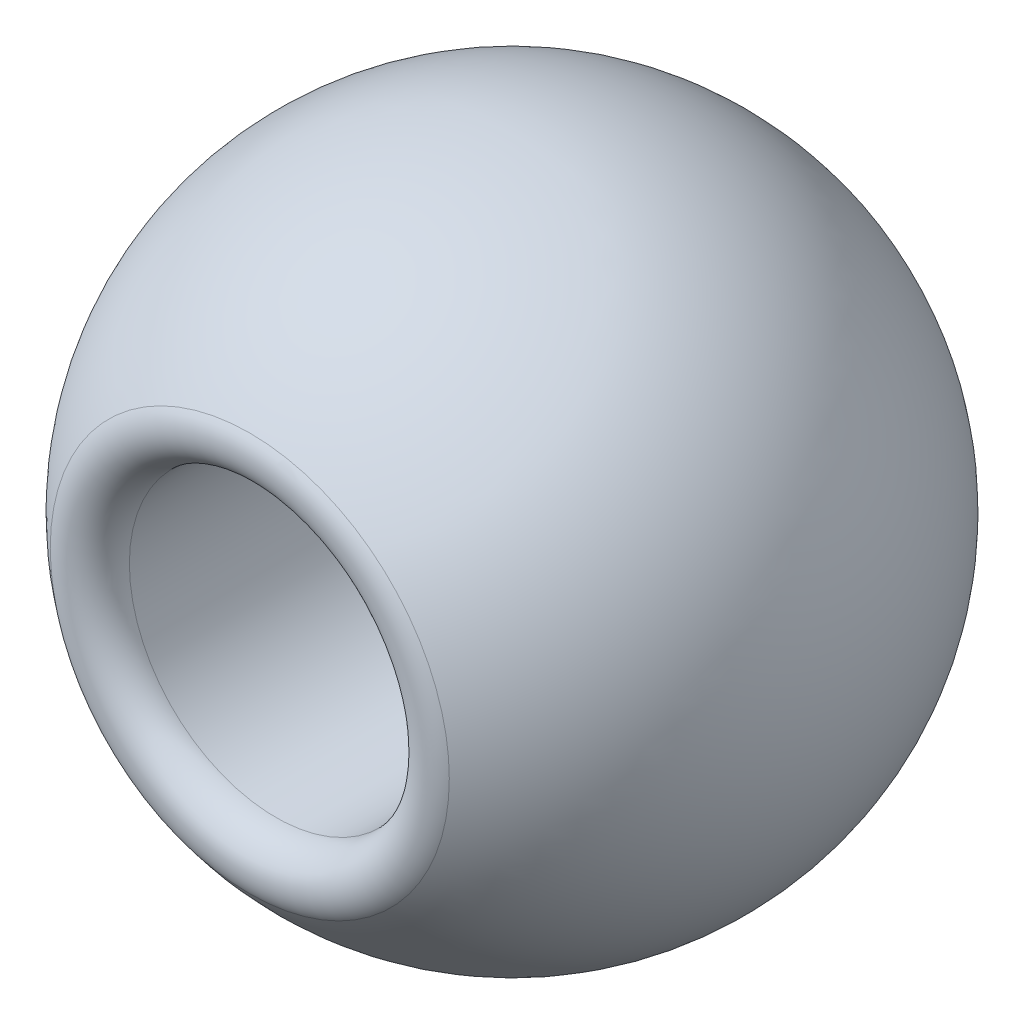
ISO-10303-21;
HEADER;
FILE_DESCRIPTION(('STEP AP214'),'2;1');
FILE_NAME('part.step','',(''),(''),'','','');
FILE_SCHEMA(('AUTOMOTIVE_DESIGN { 1 0 10303 214 1 1 1 1 }'));
ENDSEC;
DATA;
#1=APPLICATION_CONTEXT('core data for automotive mechanical design processes');
#2=APPLICATION_PROTOCOL_DEFINITION('international standard','automotive_design',2000,#1);
#3=PRODUCT_CONTEXT('',#1,'mechanical');
#4=PRODUCT('Part','Part','',(#3));
#5=PRODUCT_RELATED_PRODUCT_CATEGORY('part','',(#4));
#6=PRODUCT_DEFINITION_FORMATION('','',#4);
#7=PRODUCT_DEFINITION_CONTEXT('part definition',#1,'design');
#8=PRODUCT_DEFINITION('design','',#6,#7);
#9=PRODUCT_DEFINITION_SHAPE('','',#8);
#10=(LENGTH_UNIT() NAMED_UNIT(*) SI_UNIT(.MILLI.,.METRE.));
#11=(NAMED_UNIT(*) PLANE_ANGLE_UNIT() SI_UNIT($,.RADIAN.));
#12=(NAMED_UNIT(*) SI_UNIT($,.STERADIAN.) SOLID_ANGLE_UNIT());
#13=UNCERTAINTY_MEASURE_WITH_UNIT(LENGTH_MEASURE(1.E-05),#10,'distance_accuracy_value','');
#14=(GEOMETRIC_REPRESENTATION_CONTEXT(3) GLOBAL_UNCERTAINTY_ASSIGNED_CONTEXT((#13)) GLOBAL_UNIT_ASSIGNED_CONTEXT((#10,
#11,#12)) REPRESENTATION_CONTEXT('',''));
#15=CARTESIAN_POINT('',(0.,0.,0.));
#16=DIRECTION('',(0.,0.,1.));
#17=DIRECTION('',(1.,0.,0.));
#18=AXIS2_PLACEMENT_3D('',#15,#16,#17);
#19=CARTESIAN_POINT('',(0.,0.,0.));
#20=DIRECTION('',(0.,1.,0.));
#21=DIRECTION('',(1.,0.,0.));
#22=AXIS2_PLACEMENT_3D('',#19,#20,#21);
#23=SPHERICAL_SURFACE('',#22,10.);
#24=CARTESIAN_POINT('',(0.,0.,0.));
#25=DIRECTION('',(0.,0.,1.));
#26=DIRECTION('',(1.,0.,0.));
#27=AXIS2_PLACEMENT_3D('',#24,#25,#26);
#28=SPHERICAL_SURFACE('',#27,10.);
#29=CARTESIAN_POINT('',(0.,0.,-7.95803034133323));
#30=DIRECTION('',(0.,0.,1.));
#31=DIRECTION('',(1.,0.,0.));
#32=AXIS2_PLACEMENT_3D('',#29,#30,#31);
#33=CIRCLE('',#32,6.05555555555555);
#34=CARTESIAN_POINT('',(6.05555555555555,0.,-7.95803034133323));
#35=VERTEX_POINT('',#34);
#36=EDGE_CURVE('E10',#35,#35,#33,.T.);
#37=ORIENTED_EDGE('',*,*,#36,.T.);
#38=EDGE_LOOP('',(#37));
#39=FACE_BOUND('',#38,.T.);
#40=CARTESIAN_POINT('',(0.,0.,7.95803034133323));
#41=DIRECTION('',(0.,0.,-1.));
#42=DIRECTION('',(-1.,0.,0.));
#43=AXIS2_PLACEMENT_3D('',#40,#41,#42);
#44=CIRCLE('',#43,6.05555555555555);
#45=CARTESIAN_POINT('',(-6.05555555555555,0.,7.95803034133323));
#46=VERTEX_POINT('',#45);
#47=EDGE_CURVE('E37',#46,#46,#44,.T.);
#48=ORIENTED_EDGE('',*,*,#47,.T.);
#49=EDGE_LOOP('',(#48));
#50=FACE_BOUND('',#49,.T.);
#51=ADVANCED_FACE('F30',(#39,#50),#28,.T.);
#52=CARTESIAN_POINT('',(0.,0.,-15.));
#53=DIRECTION('',(0.,0.,1.));
#54=DIRECTION('',(1.,0.,0.));
#55=AXIS2_PLACEMENT_3D('',#52,#53,#54);
#56=CYLINDRICAL_SURFACE('',#55,4.45);
#57=CARTESIAN_POINT('',(0.,0.,-7.1622273071999));
#58=DIRECTION('',(0.,0.,1.));
#59=DIRECTION('',(1.,0.,0.));
#60=AXIS2_PLACEMENT_3D('',#57,#58,#59);
#61=CIRCLE('',#60,4.45);
#62=CARTESIAN_POINT('',(4.45,0.,-7.1622273071999));
#63=VERTEX_POINT('',#62);
#64=EDGE_CURVE('E41',#63,#63,#61,.F.);
#65=ORIENTED_EDGE('',*,*,#64,.T.);
#66=EDGE_LOOP('',(#65));
#67=FACE_BOUND('',#66,.T.);
#68=CARTESIAN_POINT('',(0.,0.,7.1622273071999));
#69=DIRECTION('',(0.,0.,-1.));
#70=DIRECTION('',(-1.,0.,0.));
#71=AXIS2_PLACEMENT_3D('',#68,#69,#70);
#72=CIRCLE('',#71,4.45);
#73=CARTESIAN_POINT('',(-4.45,0.,7.1622273071999));
#74=VERTEX_POINT('',#73);
#75=EDGE_CURVE('E45',#74,#74,#72,.F.);
#76=ORIENTED_EDGE('',*,*,#75,.T.);
#77=EDGE_LOOP('',(#76));
#78=FACE_BOUND('',#77,.T.);
#79=ADVANCED_FACE('F51',(#67,#78),#56,.F.);
#80=CARTESIAN_POINT('',(0.,0.,-7.16222730719991));
#81=DIRECTION('',(0.,0.,1.));
#82=DIRECTION('',(1.,0.,0.));
#83=AXIS2_PLACEMENT_3D('',#80,#81,#82);
#84=TOROIDAL_SURFACE('',#83,5.45,1.);
#85=ORIENTED_EDGE('',*,*,#36,.F.);
#86=EDGE_LOOP('',(#85));
#87=FACE_BOUND('',#86,.T.);
#88=ORIENTED_EDGE('',*,*,#64,.F.);
#89=EDGE_LOOP('',(#88));
#90=FACE_BOUND('',#89,.T.);
#91=ADVANCED_FACE('F54',(#87,#90),#84,.T.);
#92=CARTESIAN_POINT('',(0.,0.,7.16222730719991));
#93=DIRECTION('',(0.,0.,-1.));
#94=DIRECTION('',(-1.,0.,0.));
#95=AXIS2_PLACEMENT_3D('',#92,#93,#94);
#96=TOROIDAL_SURFACE('',#95,5.45,1.);
#97=ORIENTED_EDGE('',*,*,#47,.F.);
#98=EDGE_LOOP('',(#97));
#99=FACE_BOUND('',#98,.T.);
#100=ORIENTED_EDGE('',*,*,#75,.F.);
#101=EDGE_LOOP('',(#100));
#102=FACE_BOUND('',#101,.T.);
#103=ADVANCED_FACE('F32',(#99,#102),#96,.T.);
#104=CLOSED_SHELL('',(#51,#79,#91,#103));
#105=MANIFOLD_SOLID_BREP('B2',#104);
#106=ADVANCED_BREP_SHAPE_REPRESENTATION('',(#18,#105),#14);
#107=SHAPE_DEFINITION_REPRESENTATION(#9,#106);
ENDSEC;
END-ISO-10303-21;
